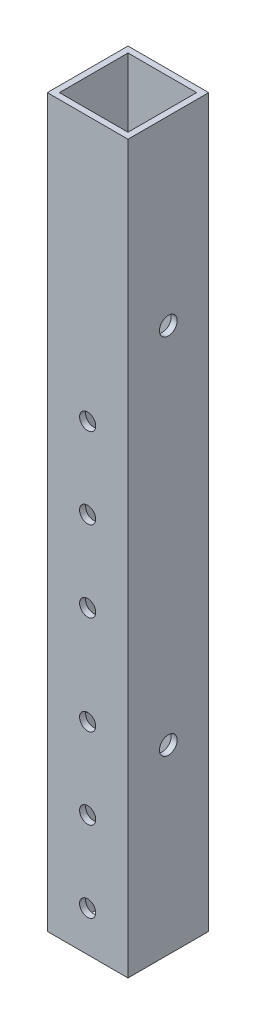
ISO-10303-21;
HEADER;
FILE_DESCRIPTION(('STEP AP214'),'2;1');
FILE_NAME('part.step','',(''),(''),'','','');
FILE_SCHEMA(('AUTOMOTIVE_DESIGN { 1 0 10303 214 1 1 1 1 }'));
ENDSEC;
DATA;
#1=APPLICATION_CONTEXT('core data for automotive mechanical design processes');
#2=APPLICATION_PROTOCOL_DEFINITION('international standard','automotive_design',2000,#1);
#3=PRODUCT_CONTEXT('',#1,'mechanical');
#4=PRODUCT('Part','Part','',(#3));
#5=PRODUCT_RELATED_PRODUCT_CATEGORY('part','',(#4));
#6=PRODUCT_DEFINITION_FORMATION('','',#4);
#7=PRODUCT_DEFINITION_CONTEXT('part definition',#1,'design');
#8=PRODUCT_DEFINITION('design','',#6,#7);
#9=PRODUCT_DEFINITION_SHAPE('','',#8);
#10=(LENGTH_UNIT() NAMED_UNIT(*) SI_UNIT(.MILLI.,.METRE.));
#11=(NAMED_UNIT(*) PLANE_ANGLE_UNIT() SI_UNIT($,.RADIAN.));
#12=(NAMED_UNIT(*) SI_UNIT($,.STERADIAN.) SOLID_ANGLE_UNIT());
#13=UNCERTAINTY_MEASURE_WITH_UNIT(LENGTH_MEASURE(1.E-05),#10,'distance_accuracy_value','');
#14=(GEOMETRIC_REPRESENTATION_CONTEXT(3) GLOBAL_UNCERTAINTY_ASSIGNED_CONTEXT((#13)) GLOBAL_UNIT_ASSIGNED_CONTEXT((#10,
#11,#12)) REPRESENTATION_CONTEXT('',''));
#15=CARTESIAN_POINT('',(0.,0.,0.));
#16=DIRECTION('',(0.,0.,1.));
#17=DIRECTION('',(1.,0.,0.));
#18=AXIS2_PLACEMENT_3D('',#15,#16,#17);
#19=CARTESIAN_POINT('',(0.,180.,0.));
#20=DIRECTION('',(0.,1.,0.));
#21=DIRECTION('',(0.,0.,1.));
#22=AXIS2_PLACEMENT_3D('',#19,#20,#21);
#23=PLANE('',#22);
#24=DIRECTION('',(0.,0.,-1.));
#25=VECTOR('',#24,1.);
#26=CARTESIAN_POINT('',(10.,180.,-10.));
#27=LINE('',#26,#25);
#28=CARTESIAN_POINT('',(10.,180.,10.));
#29=VERTEX_POINT('',#28);
#30=CARTESIAN_POINT('',(10.,180.,-10.));
#31=VERTEX_POINT('',#30);
#32=EDGE_CURVE('E144',#29,#31,#27,.T.);
#33=ORIENTED_EDGE('',*,*,#32,.T.);
#34=DIRECTION('',(-1.,0.,0.));
#35=VECTOR('',#34,1.);
#36=CARTESIAN_POINT('',(-10.,180.,-10.));
#37=LINE('',#36,#35);
#38=CARTESIAN_POINT('',(-10.,180.,-10.));
#39=VERTEX_POINT('',#38);
#40=EDGE_CURVE('E147',#31,#39,#37,.T.);
#41=ORIENTED_EDGE('',*,*,#40,.T.);
#42=DIRECTION('',(0.,0.,1.));
#43=VECTOR('',#42,1.);
#44=CARTESIAN_POINT('',(-10.,180.,-10.));
#45=LINE('',#44,#43);
#46=CARTESIAN_POINT('',(-10.,180.,10.));
#47=VERTEX_POINT('',#46);
#48=EDGE_CURVE('E150',#39,#47,#45,.T.);
#49=ORIENTED_EDGE('',*,*,#48,.T.);
#50=DIRECTION('',(1.,0.,0.));
#51=VECTOR('',#50,1.);
#52=CARTESIAN_POINT('',(-10.,180.,10.));
#53=LINE('',#52,#51);
#54=EDGE_CURVE('E152',#47,#29,#53,.T.);
#55=ORIENTED_EDGE('',*,*,#54,.T.);
#56=EDGE_LOOP('',(#33,#41,#49,#55));
#57=FACE_BOUND('',#56,.T.);
#58=DIRECTION('',(-1.,0.,0.));
#59=VECTOR('',#58,1.);
#60=CARTESIAN_POINT('',(-8.5,180.,-8.5));
#61=LINE('',#60,#59);
#62=CARTESIAN_POINT('',(8.5,180.,-8.5));
#63=VERTEX_POINT('',#62);
#64=CARTESIAN_POINT('',(-8.5,180.,-8.5));
#65=VERTEX_POINT('',#64);
#66=EDGE_CURVE('E114',#63,#65,#61,.T.);
#67=ORIENTED_EDGE('',*,*,#66,.F.);
#68=DIRECTION('',(0.,0.,-1.));
#69=VECTOR('',#68,1.);
#70=CARTESIAN_POINT('',(8.5,180.,-8.5));
#71=LINE('',#70,#69);
#72=CARTESIAN_POINT('',(8.5,180.,8.5));
#73=VERTEX_POINT('',#72);
#74=EDGE_CURVE('E106',#73,#63,#71,.T.);
#75=ORIENTED_EDGE('',*,*,#74,.F.);
#76=DIRECTION('',(1.,0.,0.));
#77=VECTOR('',#76,1.);
#78=CARTESIAN_POINT('',(-8.5,180.,8.5));
#79=LINE('',#78,#77);
#80=CARTESIAN_POINT('',(-8.5,180.,8.5));
#81=VERTEX_POINT('',#80);
#82=EDGE_CURVE('E128',#81,#73,#79,.T.);
#83=ORIENTED_EDGE('',*,*,#82,.F.);
#84=DIRECTION('',(0.,0.,1.));
#85=VECTOR('',#84,1.);
#86=CARTESIAN_POINT('',(-8.5,180.,-8.5));
#87=LINE('',#86,#85);
#88=EDGE_CURVE('E126',#65,#81,#87,.T.);
#89=ORIENTED_EDGE('',*,*,#88,.F.);
#90=EDGE_LOOP('',(#67,#75,#83,#89));
#91=FACE_BOUND('',#90,.T.);
#92=ADVANCED_FACE('F39',(#57,#91),#23,.T.);
#93=CARTESIAN_POINT('',(0.,0.,0.));
#94=DIRECTION('',(0.,1.,0.));
#95=DIRECTION('',(0.,0.,1.));
#96=AXIS2_PLACEMENT_3D('',#93,#94,#95);
#97=PLANE('',#96);
#98=DIRECTION('',(0.,0.,-1.));
#99=VECTOR('',#98,1.);
#100=CARTESIAN_POINT('',(10.,0.,-10.));
#101=LINE('',#100,#99);
#102=CARTESIAN_POINT('',(10.,0.,10.));
#103=VERTEX_POINT('',#102);
#104=CARTESIAN_POINT('',(10.,0.,-10.));
#105=VERTEX_POINT('',#104);
#106=EDGE_CURVE('E122',#103,#105,#101,.T.);
#107=ORIENTED_EDGE('',*,*,#106,.F.);
#108=DIRECTION('',(1.,0.,0.));
#109=VECTOR('',#108,1.);
#110=CARTESIAN_POINT('',(-10.,0.,10.));
#111=LINE('',#110,#109);
#112=CARTESIAN_POINT('',(-10.,0.,10.));
#113=VERTEX_POINT('',#112);
#114=EDGE_CURVE('E148',#113,#103,#111,.T.);
#115=ORIENTED_EDGE('',*,*,#114,.F.);
#116=DIRECTION('',(0.,0.,1.));
#117=VECTOR('',#116,1.);
#118=CARTESIAN_POINT('',(-10.,0.,-10.));
#119=LINE('',#118,#117);
#120=CARTESIAN_POINT('',(-10.,0.,-10.));
#121=VERTEX_POINT('',#120);
#122=EDGE_CURVE('E159',#121,#113,#119,.T.);
#123=ORIENTED_EDGE('',*,*,#122,.F.);
#124=DIRECTION('',(-1.,0.,0.));
#125=VECTOR('',#124,1.);
#126=CARTESIAN_POINT('',(-10.,0.,-10.));
#127=LINE('',#126,#125);
#128=EDGE_CURVE('E157',#105,#121,#127,.T.);
#129=ORIENTED_EDGE('',*,*,#128,.F.);
#130=EDGE_LOOP('',(#107,#115,#123,#129));
#131=FACE_BOUND('',#130,.T.);
#132=DIRECTION('',(0.,0.,-1.));
#133=VECTOR('',#132,1.);
#134=CARTESIAN_POINT('',(8.5,0.,-8.5));
#135=LINE('',#134,#133);
#136=CARTESIAN_POINT('',(8.5,0.,8.5));
#137=VERTEX_POINT('',#136);
#138=CARTESIAN_POINT('',(8.5,0.,-8.5));
#139=VERTEX_POINT('',#138);
#140=EDGE_CURVE('E64',#137,#139,#135,.T.);
#141=ORIENTED_EDGE('',*,*,#140,.T.);
#142=DIRECTION('',(-1.,0.,0.));
#143=VECTOR('',#142,1.);
#144=CARTESIAN_POINT('',(-8.5,0.,-8.5));
#145=LINE('',#144,#143);
#146=CARTESIAN_POINT('',(-8.5,0.,-8.5));
#147=VERTEX_POINT('',#146);
#148=EDGE_CURVE('E121',#139,#147,#145,.T.);
#149=ORIENTED_EDGE('',*,*,#148,.T.);
#150=DIRECTION('',(0.,0.,1.));
#151=VECTOR('',#150,1.);
#152=CARTESIAN_POINT('',(-8.5,0.,-8.5));
#153=LINE('',#152,#151);
#154=CARTESIAN_POINT('',(-8.5,0.,8.5));
#155=VERTEX_POINT('',#154);
#156=EDGE_CURVE('E136',#147,#155,#153,.T.);
#157=ORIENTED_EDGE('',*,*,#156,.T.);
#158=DIRECTION('',(1.,0.,0.));
#159=VECTOR('',#158,1.);
#160=CARTESIAN_POINT('',(-8.5,0.,8.5));
#161=LINE('',#160,#159);
#162=EDGE_CURVE('E115',#155,#137,#161,.T.);
#163=ORIENTED_EDGE('',*,*,#162,.T.);
#164=EDGE_LOOP('',(#141,#149,#157,#163));
#165=FACE_BOUND('',#164,.T.);
#166=ADVANCED_FACE('F255',(#131,#165),#97,.F.);
#167=CARTESIAN_POINT('',(10.,180.,-10.));
#168=DIRECTION('',(-1.,0.,0.));
#169=DIRECTION('',(0.,0.,1.));
#170=AXIS2_PLACEMENT_3D('',#167,#168,#169);
#171=PLANE('',#170);
#172=CARTESIAN_POINT('',(10.,135.,0.));
#173=DIRECTION('',(1.,0.,0.));
#174=DIRECTION('',(0.,0.,-1.));
#175=AXIS2_PLACEMENT_3D('',#172,#173,#174);
#176=CIRCLE('',#175,2.2);
#177=CARTESIAN_POINT('',(10.,135.,-2.2));
#178=VERTEX_POINT('',#177);
#179=EDGE_CURVE('E173',#178,#178,#176,.T.);
#180=ORIENTED_EDGE('',*,*,#179,.F.);
#181=EDGE_LOOP('',(#180));
#182=FACE_BOUND('',#181,.T.);
#183=CARTESIAN_POINT('',(10.,45.,0.));
#184=DIRECTION('',(1.,0.,0.));
#185=DIRECTION('',(0.,0.,1.));
#186=AXIS2_PLACEMENT_3D('',#183,#184,#185);
#187=CIRCLE('',#186,2.19999999999999);
#188=CARTESIAN_POINT('',(10.,45.,2.19999999999999));
#189=VERTEX_POINT('',#188);
#190=EDGE_CURVE('E189',#189,#189,#187,.T.);
#191=ORIENTED_EDGE('',*,*,#190,.F.);
#192=EDGE_LOOP('',(#191));
#193=FACE_BOUND('',#192,.T.);
#194=ORIENTED_EDGE('',*,*,#106,.T.);
#195=DIRECTION('',(0.,-1.,0.));
#196=VECTOR('',#195,1.);
#197=CARTESIAN_POINT('',(10.,180.,-10.));
#198=LINE('',#197,#196);
#199=EDGE_CURVE('E11',#31,#105,#198,.T.);
#200=ORIENTED_EDGE('',*,*,#199,.F.);
#201=ORIENTED_EDGE('',*,*,#32,.F.);
#202=DIRECTION('',(0.,-1.,0.));
#203=VECTOR('',#202,1.);
#204=CARTESIAN_POINT('',(10.,180.,10.));
#205=LINE('',#204,#203);
#206=EDGE_CURVE('E154',#29,#103,#205,.T.);
#207=ORIENTED_EDGE('',*,*,#206,.T.);
#208=EDGE_LOOP('',(#194,#200,#201,#207));
#209=FACE_BOUND('',#208,.T.);
#210=ADVANCED_FACE('F41',(#182,#193,#209),#171,.F.);
#211=CARTESIAN_POINT('',(-10.,180.,-10.));
#212=DIRECTION('',(0.,0.,1.));
#213=DIRECTION('',(1.,0.,0.));
#214=AXIS2_PLACEMENT_3D('',#211,#212,#213);
#215=PLANE('',#214);
#216=CARTESIAN_POINT('',(0.,74.45,-10.));
#217=DIRECTION('',(0.,0.,1.));
#218=DIRECTION('',(1.,0.,0.));
#219=AXIS2_PLACEMENT_3D('',#216,#217,#218);
#220=CIRCLE('',#219,2.);
#221=CARTESIAN_POINT('',(2.,74.45,-10.));
#222=VERTEX_POINT('',#221);
#223=EDGE_CURVE('E193',#222,#222,#220,.T.);
#224=ORIENTED_EDGE('',*,*,#223,.T.);
#225=EDGE_LOOP('',(#224));
#226=FACE_BOUND('',#225,.T.);
#227=CARTESIAN_POINT('',(0.,94.45,-10.));
#228=DIRECTION('',(0.,0.,1.));
#229=DIRECTION('',(1.,0.,0.));
#230=AXIS2_PLACEMENT_3D('',#227,#228,#229);
#231=CIRCLE('',#230,2.);
#232=CARTESIAN_POINT('',(2.,94.45,-10.));
#233=VERTEX_POINT('',#232);
#234=EDGE_CURVE('E284',#233,#233,#231,.T.);
#235=ORIENTED_EDGE('',*,*,#234,.T.);
#236=EDGE_LOOP('',(#235));
#237=FACE_BOUND('',#236,.T.);
#238=CARTESIAN_POINT('',(0.,114.45,-10.));
#239=DIRECTION('',(0.,0.,1.));
#240=DIRECTION('',(1.,0.,0.));
#241=AXIS2_PLACEMENT_3D('',#238,#239,#240);
#242=CIRCLE('',#241,2.);
#243=CARTESIAN_POINT('',(2.,114.45,-10.));
#244=VERTEX_POINT('',#243);
#245=EDGE_CURVE('E206',#244,#244,#242,.T.);
#246=ORIENTED_EDGE('',*,*,#245,.T.);
#247=EDGE_LOOP('',(#246));
#248=FACE_BOUND('',#247,.T.);
#249=ORIENTED_EDGE('',*,*,#128,.T.);
#250=DIRECTION('',(0.,-1.,0.));
#251=VECTOR('',#250,1.);
#252=CARTESIAN_POINT('',(-10.,180.,-10.));
#253=LINE('',#252,#251);
#254=EDGE_CURVE('E48',#39,#121,#253,.T.);
#255=ORIENTED_EDGE('',*,*,#254,.F.);
#256=ORIENTED_EDGE('',*,*,#40,.F.);
#257=ORIENTED_EDGE('',*,*,#199,.T.);
#258=EDGE_LOOP('',(#249,#255,#256,#257));
#259=FACE_BOUND('',#258,.T.);
#260=ADVANCED_FACE('F271',(#226,#237,#248,#259),#215,.F.);
#261=CARTESIAN_POINT('',(-10.,180.,-10.));
#262=DIRECTION('',(1.,0.,0.));
#263=DIRECTION('',(0.,0.,-1.));
#264=AXIS2_PLACEMENT_3D('',#261,#262,#263);
#265=PLANE('',#264);
#266=CARTESIAN_POINT('',(-9.99999999999999,135.,0.));
#267=DIRECTION('',(1.,0.,0.));
#268=DIRECTION('',(0.,0.,-1.));
#269=AXIS2_PLACEMENT_3D('',#266,#267,#268);
#270=CIRCLE('',#269,2.2);
#271=CARTESIAN_POINT('',(-10.,135.,-2.2));
#272=VERTEX_POINT('',#271);
#273=EDGE_CURVE('E134',#272,#272,#270,.T.);
#274=ORIENTED_EDGE('',*,*,#273,.T.);
#275=EDGE_LOOP('',(#274));
#276=FACE_BOUND('',#275,.T.);
#277=CARTESIAN_POINT('',(-9.99999999999999,45.,0.));
#278=DIRECTION('',(1.,0.,0.));
#279=DIRECTION('',(0.,0.,-1.));
#280=AXIS2_PLACEMENT_3D('',#277,#278,#279);
#281=CIRCLE('',#280,2.19999999999999);
#282=CARTESIAN_POINT('',(-10.,45.,-2.19999999999999));
#283=VERTEX_POINT('',#282);
#284=EDGE_CURVE('E178',#283,#283,#281,.T.);
#285=ORIENTED_EDGE('',*,*,#284,.T.);
#286=EDGE_LOOP('',(#285));
#287=FACE_BOUND('',#286,.T.);
#288=ORIENTED_EDGE('',*,*,#122,.T.);
#289=DIRECTION('',(0.,-1.,0.));
#290=VECTOR('',#289,1.);
#291=CARTESIAN_POINT('',(-10.,180.,10.));
#292=LINE('',#291,#290);
#293=EDGE_CURVE('E164',#47,#113,#292,.T.);
#294=ORIENTED_EDGE('',*,*,#293,.F.);
#295=ORIENTED_EDGE('',*,*,#48,.F.);
#296=ORIENTED_EDGE('',*,*,#254,.T.);
#297=EDGE_LOOP('',(#288,#294,#295,#296));
#298=FACE_BOUND('',#297,.T.);
#299=ADVANCED_FACE('F232',(#276,#287,#298),#265,.F.);
#300=CARTESIAN_POINT('',(-10.,180.,10.));
#301=DIRECTION('',(0.,0.,-1.));
#302=DIRECTION('',(-1.,0.,0.));
#303=AXIS2_PLACEMENT_3D('',#300,#301,#302);
#304=PLANE('',#303);
#305=CARTESIAN_POINT('',(0.,74.45,10.));
#306=DIRECTION('',(0.,0.,1.));
#307=DIRECTION('',(1.,0.,0.));
#308=AXIS2_PLACEMENT_3D('',#305,#306,#307);
#309=CIRCLE('',#308,2.);
#310=CARTESIAN_POINT('',(2.,74.45,10.));
#311=VERTEX_POINT('',#310);
#312=EDGE_CURVE('E336',#311,#311,#309,.T.);
#313=ORIENTED_EDGE('',*,*,#312,.F.);
#314=EDGE_LOOP('',(#313));
#315=FACE_BOUND('',#314,.T.);
#316=CARTESIAN_POINT('',(0.,94.45,10.));
#317=DIRECTION('',(0.,0.,1.));
#318=DIRECTION('',(1.,0.,0.));
#319=AXIS2_PLACEMENT_3D('',#316,#317,#318);
#320=CIRCLE('',#319,2.);
#321=CARTESIAN_POINT('',(2.,94.45,10.));
#322=VERTEX_POINT('',#321);
#323=EDGE_CURVE('E332',#322,#322,#320,.T.);
#324=ORIENTED_EDGE('',*,*,#323,.F.);
#325=EDGE_LOOP('',(#324));
#326=FACE_BOUND('',#325,.T.);
#327=CARTESIAN_POINT('',(0.,114.45,10.));
#328=DIRECTION('',(0.,0.,1.));
#329=DIRECTION('',(1.,0.,0.));
#330=AXIS2_PLACEMENT_3D('',#327,#328,#329);
#331=CIRCLE('',#330,2.);
#332=CARTESIAN_POINT('',(2.,114.45,10.));
#333=VERTEX_POINT('',#332);
#334=EDGE_CURVE('E333',#333,#333,#331,.T.);
#335=ORIENTED_EDGE('',*,*,#334,.F.);
#336=EDGE_LOOP('',(#335));
#337=FACE_BOUND('',#336,.T.);
#338=CARTESIAN_POINT('',(0.,10.,10.));
#339=DIRECTION('',(0.,0.,1.));
#340=DIRECTION('',(1.,0.,0.));
#341=AXIS2_PLACEMENT_3D('',#338,#339,#340);
#342=CIRCLE('',#341,2.);
#343=CARTESIAN_POINT('',(2.,10.,10.));
#344=VERTEX_POINT('',#343);
#345=EDGE_CURVE('E183',#344,#344,#342,.T.);
#346=ORIENTED_EDGE('',*,*,#345,.F.);
#347=EDGE_LOOP('',(#346));
#348=FACE_BOUND('',#347,.T.);
#349=CARTESIAN_POINT('',(0.,30.,10.));
#350=DIRECTION('',(0.,0.,1.));
#351=DIRECTION('',(1.,0.,0.));
#352=AXIS2_PLACEMENT_3D('',#349,#350,#351);
#353=CIRCLE('',#352,2.);
#354=CARTESIAN_POINT('',(2.,30.,10.));
#355=VERTEX_POINT('',#354);
#356=EDGE_CURVE('E215',#355,#355,#353,.T.);
#357=ORIENTED_EDGE('',*,*,#356,.F.);
#358=EDGE_LOOP('',(#357));
#359=FACE_BOUND('',#358,.T.);
#360=CARTESIAN_POINT('',(0.,50.,10.));
#361=DIRECTION('',(0.,0.,1.));
#362=DIRECTION('',(1.,0.,0.));
#363=AXIS2_PLACEMENT_3D('',#360,#361,#362);
#364=CIRCLE('',#363,2.);
#365=CARTESIAN_POINT('',(2.,50.,10.));
#366=VERTEX_POINT('',#365);
#367=EDGE_CURVE('E212',#366,#366,#364,.T.);
#368=ORIENTED_EDGE('',*,*,#367,.F.);
#369=EDGE_LOOP('',(#368));
#370=FACE_BOUND('',#369,.T.);
#371=ORIENTED_EDGE('',*,*,#114,.T.);
#372=ORIENTED_EDGE('',*,*,#206,.F.);
#373=ORIENTED_EDGE('',*,*,#54,.F.);
#374=ORIENTED_EDGE('',*,*,#293,.T.);
#375=EDGE_LOOP('',(#371,#372,#373,#374));
#376=FACE_BOUND('',#375,.T.);
#377=ADVANCED_FACE('F266',(#315,#326,#337,#348,#359,#370,#376),#304,.F.);
#378=CARTESIAN_POINT('',(8.5,180.,-8.5));
#379=DIRECTION('',(-1.,0.,0.));
#380=DIRECTION('',(0.,0.,1.));
#381=AXIS2_PLACEMENT_3D('',#378,#379,#380);
#382=PLANE('',#381);
#383=CARTESIAN_POINT('',(8.50000000000001,135.,0.));
#384=DIRECTION('',(-1.,0.,0.));
#385=DIRECTION('',(0.,0.,1.));
#386=AXIS2_PLACEMENT_3D('',#383,#384,#385);
#387=CIRCLE('',#386,2.2);
#388=CARTESIAN_POINT('',(8.50000000000001,135.,2.2));
#389=VERTEX_POINT('',#388);
#390=EDGE_CURVE('E177',#389,#389,#387,.T.);
#391=ORIENTED_EDGE('',*,*,#390,.F.);
#392=EDGE_LOOP('',(#391));
#393=FACE_BOUND('',#392,.T.);
#394=CARTESIAN_POINT('',(8.50000000000001,45.,0.));
#395=DIRECTION('',(-1.,0.,0.));
#396=DIRECTION('',(0.,0.,1.));
#397=AXIS2_PLACEMENT_3D('',#394,#395,#396);
#398=CIRCLE('',#397,2.19999999999999);
#399=CARTESIAN_POINT('',(8.50000000000001,45.,2.19999999999999));
#400=VERTEX_POINT('',#399);
#401=EDGE_CURVE('E172',#400,#400,#398,.T.);
#402=ORIENTED_EDGE('',*,*,#401,.F.);
#403=EDGE_LOOP('',(#402));
#404=FACE_BOUND('',#403,.T.);
#405=ORIENTED_EDGE('',*,*,#140,.F.);
#406=DIRECTION('',(0.,-1.,0.));
#407=VECTOR('',#406,1.);
#408=CARTESIAN_POINT('',(8.5,180.,8.5));
#409=LINE('',#408,#407);
#410=EDGE_CURVE('E110',#73,#137,#409,.T.);
#411=ORIENTED_EDGE('',*,*,#410,.F.);
#412=ORIENTED_EDGE('',*,*,#74,.T.);
#413=DIRECTION('',(0.,-1.,0.));
#414=VECTOR('',#413,1.);
#415=CARTESIAN_POINT('',(8.5,180.,-8.5));
#416=LINE('',#415,#414);
#417=EDGE_CURVE('E109',#63,#139,#416,.T.);
#418=ORIENTED_EDGE('',*,*,#417,.T.);
#419=EDGE_LOOP('',(#405,#411,#412,#418));
#420=FACE_BOUND('',#419,.T.);
#421=ADVANCED_FACE('F108',(#393,#404,#420),#382,.T.);
#422=CARTESIAN_POINT('',(-8.5,180.,-8.5));
#423=DIRECTION('',(0.,0.,1.));
#424=DIRECTION('',(1.,0.,0.));
#425=AXIS2_PLACEMENT_3D('',#422,#423,#424);
#426=PLANE('',#425);
#427=CARTESIAN_POINT('',(0.,74.45,-8.5));
#428=DIRECTION('',(0.,0.,1.));
#429=DIRECTION('',(1.,0.,0.));
#430=AXIS2_PLACEMENT_3D('',#427,#428,#429);
#431=CIRCLE('',#430,2.);
#432=CARTESIAN_POINT('',(2.,74.45,-8.5));
#433=VERTEX_POINT('',#432);
#434=EDGE_CURVE('E209',#433,#433,#431,.T.);
#435=ORIENTED_EDGE('',*,*,#434,.F.);
#436=EDGE_LOOP('',(#435));
#437=FACE_BOUND('',#436,.T.);
#438=CARTESIAN_POINT('',(0.,94.45,-8.5));
#439=DIRECTION('',(0.,0.,1.));
#440=DIRECTION('',(1.,0.,0.));
#441=AXIS2_PLACEMENT_3D('',#438,#439,#440);
#442=CIRCLE('',#441,2.);
#443=CARTESIAN_POINT('',(2.,94.45,-8.5));
#444=VERTEX_POINT('',#443);
#445=EDGE_CURVE('E196',#444,#444,#442,.T.);
#446=ORIENTED_EDGE('',*,*,#445,.F.);
#447=EDGE_LOOP('',(#446));
#448=FACE_BOUND('',#447,.T.);
#449=CARTESIAN_POINT('',(0.,114.45,-8.5));
#450=DIRECTION('',(0.,0.,1.));
#451=DIRECTION('',(1.,0.,0.));
#452=AXIS2_PLACEMENT_3D('',#449,#450,#451);
#453=CIRCLE('',#452,2.);
#454=CARTESIAN_POINT('',(2.,114.45,-8.5));
#455=VERTEX_POINT('',#454);
#456=EDGE_CURVE('E192',#455,#455,#453,.T.);
#457=ORIENTED_EDGE('',*,*,#456,.F.);
#458=EDGE_LOOP('',(#457));
#459=FACE_BOUND('',#458,.T.);
#460=ORIENTED_EDGE('',*,*,#148,.F.);
#461=ORIENTED_EDGE('',*,*,#417,.F.);
#462=ORIENTED_EDGE('',*,*,#66,.T.);
#463=DIRECTION('',(0.,-1.,0.));
#464=VECTOR('',#463,1.);
#465=CARTESIAN_POINT('',(-8.5,180.,-8.5));
#466=LINE('',#465,#464);
#467=EDGE_CURVE('E123',#65,#147,#466,.T.);
#468=ORIENTED_EDGE('',*,*,#467,.T.);
#469=EDGE_LOOP('',(#460,#461,#462,#468));
#470=FACE_BOUND('',#469,.T.);
#471=ADVANCED_FACE('F118',(#437,#448,#459,#470),#426,.T.);
#472=CARTESIAN_POINT('',(-8.5,180.,-8.5));
#473=DIRECTION('',(1.,0.,0.));
#474=DIRECTION('',(0.,0.,-1.));
#475=AXIS2_PLACEMENT_3D('',#472,#473,#474);
#476=PLANE('',#475);
#477=CARTESIAN_POINT('',(-8.50000000000001,135.,0.));
#478=DIRECTION('',(1.,0.,0.));
#479=DIRECTION('',(0.,0.,-1.));
#480=AXIS2_PLACEMENT_3D('',#477,#478,#479);
#481=CIRCLE('',#480,2.2);
#482=CARTESIAN_POINT('',(-8.50000000000001,135.,-2.2));
#483=VERTEX_POINT('',#482);
#484=EDGE_CURVE('E174',#483,#483,#481,.T.);
#485=ORIENTED_EDGE('',*,*,#484,.F.);
#486=EDGE_LOOP('',(#485));
#487=FACE_BOUND('',#486,.T.);
#488=CARTESIAN_POINT('',(-8.50000000000001,45.,0.));
#489=DIRECTION('',(1.,0.,0.));
#490=DIRECTION('',(0.,0.,-1.));
#491=AXIS2_PLACEMENT_3D('',#488,#489,#490);
#492=CIRCLE('',#491,2.19999999999999);
#493=CARTESIAN_POINT('',(-8.50000000000001,45.,-2.19999999999999));
#494=VERTEX_POINT('',#493);
#495=EDGE_CURVE('E169',#494,#494,#492,.T.);
#496=ORIENTED_EDGE('',*,*,#495,.F.);
#497=EDGE_LOOP('',(#496));
#498=FACE_BOUND('',#497,.T.);
#499=ORIENTED_EDGE('',*,*,#156,.F.);
#500=ORIENTED_EDGE('',*,*,#467,.F.);
#501=ORIENTED_EDGE('',*,*,#88,.T.);
#502=DIRECTION('',(0.,-1.,0.));
#503=VECTOR('',#502,1.);
#504=CARTESIAN_POINT('',(-8.5,180.,8.5));
#505=LINE('',#504,#503);
#506=EDGE_CURVE('E56',#81,#155,#505,.T.);
#507=ORIENTED_EDGE('',*,*,#506,.T.);
#508=EDGE_LOOP('',(#499,#500,#501,#507));
#509=FACE_BOUND('',#508,.T.);
#510=ADVANCED_FACE('F304',(#487,#498,#509),#476,.T.);
#511=CARTESIAN_POINT('',(-8.5,180.,8.5));
#512=DIRECTION('',(0.,0.,-1.));
#513=DIRECTION('',(-1.,0.,0.));
#514=AXIS2_PLACEMENT_3D('',#511,#512,#513);
#515=PLANE('',#514);
#516=CARTESIAN_POINT('',(0.,74.45,8.5));
#517=DIRECTION('',(0.,0.,-1.));
#518=DIRECTION('',(-1.,0.,0.));
#519=AXIS2_PLACEMENT_3D('',#516,#517,#518);
#520=CIRCLE('',#519,2.);
#521=CARTESIAN_POINT('',(-2.,74.45,8.5));
#522=VERTEX_POINT('',#521);
#523=EDGE_CURVE('E43',#522,#522,#520,.T.);
#524=ORIENTED_EDGE('',*,*,#523,.F.);
#525=EDGE_LOOP('',(#524));
#526=FACE_BOUND('',#525,.T.);
#527=CARTESIAN_POINT('',(0.,94.45,8.5));
#528=DIRECTION('',(0.,0.,-1.));
#529=DIRECTION('',(-1.,0.,0.));
#530=AXIS2_PLACEMENT_3D('',#527,#528,#529);
#531=CIRCLE('',#530,2.);
#532=CARTESIAN_POINT('',(-2.,94.45,8.5));
#533=VERTEX_POINT('',#532);
#534=EDGE_CURVE('E194',#533,#533,#531,.T.);
#535=ORIENTED_EDGE('',*,*,#534,.F.);
#536=EDGE_LOOP('',(#535));
#537=FACE_BOUND('',#536,.T.);
#538=CARTESIAN_POINT('',(0.,114.45,8.5));
#539=DIRECTION('',(0.,0.,-1.));
#540=DIRECTION('',(-1.,0.,0.));
#541=AXIS2_PLACEMENT_3D('',#538,#539,#540);
#542=CIRCLE('',#541,2.);
#543=CARTESIAN_POINT('',(-2.,114.45,8.5));
#544=VERTEX_POINT('',#543);
#545=EDGE_CURVE('E190',#544,#544,#542,.T.);
#546=ORIENTED_EDGE('',*,*,#545,.F.);
#547=EDGE_LOOP('',(#546));
#548=FACE_BOUND('',#547,.T.);
#549=CARTESIAN_POINT('',(0.,10.,8.5));
#550=DIRECTION('',(0.,0.,-1.));
#551=DIRECTION('',(-1.,0.,0.));
#552=AXIS2_PLACEMENT_3D('',#549,#550,#551);
#553=CIRCLE('',#552,2.);
#554=CARTESIAN_POINT('',(-2.,10.,8.5));
#555=VERTEX_POINT('',#554);
#556=EDGE_CURVE('E186',#555,#555,#553,.T.);
#557=ORIENTED_EDGE('',*,*,#556,.F.);
#558=EDGE_LOOP('',(#557));
#559=FACE_BOUND('',#558,.T.);
#560=CARTESIAN_POINT('',(0.,30.,8.5));
#561=DIRECTION('',(0.,0.,-1.));
#562=DIRECTION('',(-1.,0.,0.));
#563=AXIS2_PLACEMENT_3D('',#560,#561,#562);
#564=CIRCLE('',#563,2.);
#565=CARTESIAN_POINT('',(-2.,30.,8.5));
#566=VERTEX_POINT('',#565);
#567=EDGE_CURVE('E182',#566,#566,#564,.T.);
#568=ORIENTED_EDGE('',*,*,#567,.F.);
#569=EDGE_LOOP('',(#568));
#570=FACE_BOUND('',#569,.T.);
#571=CARTESIAN_POINT('',(0.,50.,8.5));
#572=DIRECTION('',(0.,0.,-1.));
#573=DIRECTION('',(-1.,0.,0.));
#574=AXIS2_PLACEMENT_3D('',#571,#572,#573);
#575=CIRCLE('',#574,2.);
#576=CARTESIAN_POINT('',(-2.,50.,8.5));
#577=VERTEX_POINT('',#576);
#578=EDGE_CURVE('E179',#577,#577,#575,.T.);
#579=ORIENTED_EDGE('',*,*,#578,.F.);
#580=EDGE_LOOP('',(#579));
#581=FACE_BOUND('',#580,.T.);
#582=ORIENTED_EDGE('',*,*,#162,.F.);
#583=ORIENTED_EDGE('',*,*,#506,.F.);
#584=ORIENTED_EDGE('',*,*,#82,.T.);
#585=ORIENTED_EDGE('',*,*,#410,.T.);
#586=EDGE_LOOP('',(#582,#583,#584,#585));
#587=FACE_BOUND('',#586,.T.);
#588=ADVANCED_FACE('F248',(#526,#537,#548,#559,#570,#581,#587),#515,.T.);
#589=CARTESIAN_POINT('',(-110.,45.,0.));
#590=DIRECTION('',(1.,0.,0.));
#591=DIRECTION('',(0.,0.,-1.));
#592=AXIS2_PLACEMENT_3D('',#589,#590,#591);
#593=CYLINDRICAL_SURFACE('',#592,2.19999999999999);
#594=CARTESIAN_POINT('',(-8.50000000000001,45.,-2.19999999999999));
#595=CARTESIAN_POINT('',(-8.51562500000001,45.,-2.19999999999999));
#596=CARTESIAN_POINT('',(-8.53125000000001,45.,-2.19999999999999));
#597=CARTESIAN_POINT('',(-8.56250000000001,45.,-2.19999999999999));
#598=CARTESIAN_POINT('',(-8.57812500000001,45.,-2.19999999999999));
#599=CARTESIAN_POINT('',(-8.60937500000001,45.,-2.19999999999999));
#600=CARTESIAN_POINT('',(-8.62500000000001,45.,-2.19999999999999));
#601=CARTESIAN_POINT('',(-8.65625000000001,45.,-2.19999999999999));
#602=CARTESIAN_POINT('',(-8.67187500000001,45.,-2.19999999999999));
#603=CARTESIAN_POINT('',(-8.70312500000001,45.,-2.19999999999999));
#604=CARTESIAN_POINT('',(-8.71875000000001,45.,-2.19999999999999));
#605=CARTESIAN_POINT('',(-8.75,45.,-2.19999999999999));
#606=CARTESIAN_POINT('',(-8.765625,45.,-2.19999999999999));
#607=CARTESIAN_POINT('',(-8.796875,45.,-2.19999999999999));
#608=CARTESIAN_POINT('',(-8.81250000000001,45.,-2.19999999999999));
#609=CARTESIAN_POINT('',(-8.84375000000001,45.,-2.19999999999999));
#610=CARTESIAN_POINT('',(-8.85937500000001,45.,-2.19999999999999));
#611=CARTESIAN_POINT('',(-8.89062500000001,45.,-2.19999999999999));
#612=CARTESIAN_POINT('',(-8.90625000000001,45.,-2.19999999999999));
#613=CARTESIAN_POINT('',(-8.93750000000001,45.,-2.19999999999999));
#614=CARTESIAN_POINT('',(-8.95312500000001,45.,-2.19999999999999));
#615=CARTESIAN_POINT('',(-8.98437500000001,45.,-2.19999999999999));
#616=CARTESIAN_POINT('',(-9.00000000000001,45.,-2.19999999999999));
#617=CARTESIAN_POINT('',(-9.03125000000001,45.,-2.19999999999999));
#618=CARTESIAN_POINT('',(-9.04687500000001,45.,-2.19999999999999));
#619=CARTESIAN_POINT('',(-9.078125,45.,-2.19999999999999));
#620=CARTESIAN_POINT('',(-9.09375,45.,-2.19999999999999));
#621=CARTESIAN_POINT('',(-9.125,45.,-2.19999999999999));
#622=CARTESIAN_POINT('',(-9.14062500000001,45.,-2.19999999999999));
#623=CARTESIAN_POINT('',(-9.17187500000001,45.,-2.19999999999999));
#624=CARTESIAN_POINT('',(-9.18750000000001,45.,-2.19999999999999));
#625=CARTESIAN_POINT('',(-9.21875000000001,45.,-2.19999999999999));
#626=CARTESIAN_POINT('',(-9.23437500000001,45.,-2.19999999999999));
#627=CARTESIAN_POINT('',(-9.26562500000001,45.,-2.19999999999999));
#628=CARTESIAN_POINT('',(-9.28125000000001,45.,-2.19999999999999));
#629=CARTESIAN_POINT('',(-9.31250000000001,45.,-2.19999999999999));
#630=CARTESIAN_POINT('',(-9.32812500000001,45.,-2.19999999999999));
#631=CARTESIAN_POINT('',(-9.35937500000001,45.,-2.19999999999999));
#632=CARTESIAN_POINT('',(-9.37500000000001,45.,-2.19999999999999));
#633=CARTESIAN_POINT('',(-9.40625000000001,45.,-2.19999999999999));
#634=CARTESIAN_POINT('',(-9.42187500000002,45.,-2.19999999999999));
#635=CARTESIAN_POINT('',(-9.45312500000001,45.,-2.19999999999999));
#636=CARTESIAN_POINT('',(-9.46875000000001,45.,-2.19999999999999));
#637=CARTESIAN_POINT('',(-9.5,45.,-2.19999999999999));
#638=CARTESIAN_POINT('',(-9.51562500000001,45.,-2.19999999999999));
#639=CARTESIAN_POINT('',(-9.54687500000001,45.,-2.19999999999999));
#640=CARTESIAN_POINT('',(-9.56250000000001,45.,-2.19999999999999));
#641=CARTESIAN_POINT('',(-9.59375000000001,45.,-2.19999999999999));
#642=CARTESIAN_POINT('',(-9.60937500000001,45.,-2.19999999999999));
#643=CARTESIAN_POINT('',(-9.64062500000001,45.,-2.19999999999999));
#644=CARTESIAN_POINT('',(-9.65625000000001,45.,-2.19999999999999));
#645=CARTESIAN_POINT('',(-9.68750000000001,45.,-2.19999999999999));
#646=CARTESIAN_POINT('',(-9.70312500000001,45.,-2.19999999999999));
#647=CARTESIAN_POINT('',(-9.73437500000001,45.,-2.19999999999999));
#648=CARTESIAN_POINT('',(-9.75000000000001,45.,-2.19999999999999));
#649=CARTESIAN_POINT('',(-9.78125000000001,45.,-2.19999999999999));
#650=CARTESIAN_POINT('',(-9.79687500000001,45.,-2.19999999999999));
#651=CARTESIAN_POINT('',(-9.828125,45.,-2.19999999999999));
#652=CARTESIAN_POINT('',(-9.84375,45.,-2.19999999999999));
#653=CARTESIAN_POINT('',(-9.875,45.,-2.19999999999999));
#654=CARTESIAN_POINT('',(-9.89062500000001,45.,-2.19999999999999));
#655=CARTESIAN_POINT('',(-9.92187500000001,45.,-2.19999999999999));
#656=CARTESIAN_POINT('',(-9.93750000000001,45.,-2.19999999999999));
#657=CARTESIAN_POINT('',(-9.96875000000001,45.,-2.19999999999999));
#658=CARTESIAN_POINT('',(-9.98437500000001,45.,-2.19999999999999));
#659=CARTESIAN_POINT('',(-10.,45.,-2.19999999999999));
#660=B_SPLINE_CURVE_WITH_KNOTS('',3,(#594,#595,#596,#597,#598,#599,#600,#601,#602,#603,#604,
#605,#606,#607,#608,#609,#610,#611,#612,#613,#614,#615,#616,#617,#618,#619,#620,#621,#622,#623,
#624,#625,#626,#627,#628,#629,#630,#631,#632,#633,#634,#635,#636,#637,#638,#639,#640,#641,#642,
#643,#644,#645,#646,#647,#648,#649,#650,#651,#652,#653,#654,#655,#656,#657,#658,#659),
.UNSPECIFIED.,.F.,.F.,(4,2,2,2,2,2,2,2,2,2,2,2,2,2,2,2,2,2,2,2,2,2,2,2,2,2,2,2,2,2,2,2,4),(0.,
0.0468750000000018,0.0937500000000036,0.140625000000005,0.187500000000007,0.234374999999995,
0.281249999999997,0.328124999999999,0.375,0.421875000000002,0.468750000000004,0.515625000000006,
0.562499999999994,0.609374999999995,0.656249999999997,0.703124999999999,0.750000000000001,
0.796875000000002,0.843750000000004,0.890625000000006,0.937500000000008,0.984374999999996,
1.03125,1.078125,1.125,1.171875,1.21875,1.26562500000001,1.31249999999999,1.359375,1.40625,
1.453125,1.5),.UNSPECIFIED.);
#661=EDGE_CURVE('BSEAM238',#494,#283,#660,.T.);
#662=ORIENTED_EDGE('',*,*,#495,.T.);
#663=ORIENTED_EDGE('',*,*,#284,.F.);
#664=ORIENTED_EDGE('',*,*,#661,.T.);
#665=ORIENTED_EDGE('',*,*,#661,.F.);
#666=EDGE_LOOP('',(#662,#664,#663,#665));
#667=FACE_BOUND('',#666,.T.);
#668=ADVANCED_FACE('F238',(#667),#593,.F.);
#669=CARTESIAN_POINT('',(-110.,135.,0.));
#670=DIRECTION('',(1.,0.,0.));
#671=DIRECTION('',(0.,0.,-1.));
#672=AXIS2_PLACEMENT_3D('',#669,#670,#671);
#673=CYLINDRICAL_SURFACE('',#672,2.2);
#674=CARTESIAN_POINT('',(-8.50000000000001,135.,-2.2));
#675=CARTESIAN_POINT('',(-8.51562500000001,135.,-2.2));
#676=CARTESIAN_POINT('',(-8.53125000000001,135.,-2.2));
#677=CARTESIAN_POINT('',(-8.56250000000001,135.,-2.2));
#678=CARTESIAN_POINT('',(-8.57812500000001,135.,-2.2));
#679=CARTESIAN_POINT('',(-8.60937500000001,135.,-2.2));
#680=CARTESIAN_POINT('',(-8.62500000000001,135.,-2.2));
#681=CARTESIAN_POINT('',(-8.65625000000001,135.,-2.2));
#682=CARTESIAN_POINT('',(-8.67187500000001,135.,-2.2));
#683=CARTESIAN_POINT('',(-8.70312500000001,135.,-2.2));
#684=CARTESIAN_POINT('',(-8.71875000000001,135.,-2.2));
#685=CARTESIAN_POINT('',(-8.75,135.,-2.2));
#686=CARTESIAN_POINT('',(-8.765625,135.,-2.2));
#687=CARTESIAN_POINT('',(-8.796875,135.,-2.2));
#688=CARTESIAN_POINT('',(-8.81250000000001,135.,-2.2));
#689=CARTESIAN_POINT('',(-8.84375000000001,135.,-2.2));
#690=CARTESIAN_POINT('',(-8.85937500000001,135.,-2.2));
#691=CARTESIAN_POINT('',(-8.89062500000001,135.,-2.2));
#692=CARTESIAN_POINT('',(-8.90625000000001,135.,-2.2));
#693=CARTESIAN_POINT('',(-8.93750000000001,135.,-2.2));
#694=CARTESIAN_POINT('',(-8.95312500000001,135.,-2.2));
#695=CARTESIAN_POINT('',(-8.98437500000001,135.,-2.2));
#696=CARTESIAN_POINT('',(-9.00000000000001,135.,-2.2));
#697=CARTESIAN_POINT('',(-9.03125000000001,135.,-2.2));
#698=CARTESIAN_POINT('',(-9.04687500000001,135.,-2.2));
#699=CARTESIAN_POINT('',(-9.078125,135.,-2.2));
#700=CARTESIAN_POINT('',(-9.09375,135.,-2.2));
#701=CARTESIAN_POINT('',(-9.125,135.,-2.2));
#702=CARTESIAN_POINT('',(-9.14062500000001,135.,-2.2));
#703=CARTESIAN_POINT('',(-9.17187500000001,135.,-2.2));
#704=CARTESIAN_POINT('',(-9.18750000000001,135.,-2.2));
#705=CARTESIAN_POINT('',(-9.21875000000001,135.,-2.2));
#706=CARTESIAN_POINT('',(-9.23437500000001,135.,-2.2));
#707=CARTESIAN_POINT('',(-9.26562500000001,135.,-2.2));
#708=CARTESIAN_POINT('',(-9.28125000000001,135.,-2.2));
#709=CARTESIAN_POINT('',(-9.31250000000001,135.,-2.2));
#710=CARTESIAN_POINT('',(-9.32812500000001,135.,-2.2));
#711=CARTESIAN_POINT('',(-9.35937500000001,135.,-2.2));
#712=CARTESIAN_POINT('',(-9.37500000000001,135.,-2.2));
#713=CARTESIAN_POINT('',(-9.40625000000001,135.,-2.2));
#714=CARTESIAN_POINT('',(-9.42187500000002,135.,-2.2));
#715=CARTESIAN_POINT('',(-9.45312500000001,135.,-2.2));
#716=CARTESIAN_POINT('',(-9.46875000000001,135.,-2.2));
#717=CARTESIAN_POINT('',(-9.5,135.,-2.2));
#718=CARTESIAN_POINT('',(-9.51562500000001,135.,-2.2));
#719=CARTESIAN_POINT('',(-9.54687500000001,135.,-2.2));
#720=CARTESIAN_POINT('',(-9.56250000000001,135.,-2.2));
#721=CARTESIAN_POINT('',(-9.59375000000001,135.,-2.2));
#722=CARTESIAN_POINT('',(-9.60937500000001,135.,-2.2));
#723=CARTESIAN_POINT('',(-9.64062500000001,135.,-2.2));
#724=CARTESIAN_POINT('',(-9.65625000000001,135.,-2.2));
#725=CARTESIAN_POINT('',(-9.68750000000001,135.,-2.2));
#726=CARTESIAN_POINT('',(-9.70312500000001,135.,-2.2));
#727=CARTESIAN_POINT('',(-9.73437500000001,135.,-2.2));
#728=CARTESIAN_POINT('',(-9.75000000000001,135.,-2.2));
#729=CARTESIAN_POINT('',(-9.78125000000001,135.,-2.2));
#730=CARTESIAN_POINT('',(-9.79687500000001,135.,-2.2));
#731=CARTESIAN_POINT('',(-9.828125,135.,-2.2));
#732=CARTESIAN_POINT('',(-9.84375,135.,-2.2));
#733=CARTESIAN_POINT('',(-9.875,135.,-2.2));
#734=CARTESIAN_POINT('',(-9.89062500000001,135.,-2.2));
#735=CARTESIAN_POINT('',(-9.92187500000001,135.,-2.2));
#736=CARTESIAN_POINT('',(-9.93750000000001,135.,-2.2));
#737=CARTESIAN_POINT('',(-9.96875000000001,135.,-2.2));
#738=CARTESIAN_POINT('',(-9.98437500000001,135.,-2.2));
#739=CARTESIAN_POINT('',(-10.,135.,-2.2));
#740=B_SPLINE_CURVE_WITH_KNOTS('',3,(#674,#675,#676,#677,#678,#679,#680,#681,#682,#683,#684,
#685,#686,#687,#688,#689,#690,#691,#692,#693,#694,#695,#696,#697,#698,#699,#700,#701,#702,#703,
#704,#705,#706,#707,#708,#709,#710,#711,#712,#713,#714,#715,#716,#717,#718,#719,#720,#721,#722,
#723,#724,#725,#726,#727,#728,#729,#730,#731,#732,#733,#734,#735,#736,#737,#738,#739),
.UNSPECIFIED.,.F.,.F.,(4,2,2,2,2,2,2,2,2,2,2,2,2,2,2,2,2,2,2,2,2,2,2,2,2,2,2,2,2,2,2,2,4),(0.,
0.0468750000000018,0.0937500000000036,0.140625000000005,0.187500000000007,0.234374999999995,
0.281249999999997,0.328124999999999,0.375,0.421875000000002,0.468750000000004,0.515625000000006,
0.562499999999994,0.609374999999995,0.656249999999997,0.703124999999999,0.750000000000001,
0.796875000000002,0.843750000000004,0.890625000000006,0.937500000000008,0.984374999999996,
1.03125,1.078125,1.125,1.171875,1.21875,1.26562500000001,1.31249999999999,1.359375,1.40625,
1.453125,1.5),.UNSPECIFIED.);
#741=EDGE_CURVE('BSEAM235',#483,#272,#740,.T.);
#742=ORIENTED_EDGE('',*,*,#484,.T.);
#743=ORIENTED_EDGE('',*,*,#273,.F.);
#744=ORIENTED_EDGE('',*,*,#741,.T.);
#745=ORIENTED_EDGE('',*,*,#741,.F.);
#746=EDGE_LOOP('',(#742,#744,#743,#745));
#747=FACE_BOUND('',#746,.T.);
#748=ADVANCED_FACE('F235',(#747),#673,.F.);
#749=ORIENTED_EDGE('',*,*,#401,.T.);
#750=EDGE_LOOP('',(#749));
#751=FACE_BOUND('',#750,.T.);
#752=ORIENTED_EDGE('',*,*,#190,.T.);
#753=EDGE_LOOP('',(#752));
#754=FACE_BOUND('',#753,.T.);
#755=ADVANCED_FACE('F237',(#751,#754),#593,.F.);
#756=ORIENTED_EDGE('',*,*,#390,.T.);
#757=EDGE_LOOP('',(#756));
#758=FACE_BOUND('',#757,.T.);
#759=ORIENTED_EDGE('',*,*,#179,.T.);
#760=EDGE_LOOP('',(#759));
#761=FACE_BOUND('',#760,.T.);
#762=ADVANCED_FACE('F241',(#758,#761),#673,.F.);
#763=CARTESIAN_POINT('',(0.,50.,7.));
#764=DIRECTION('',(0.,0.,1.));
#765=DIRECTION('',(1.,0.,0.));
#766=AXIS2_PLACEMENT_3D('',#763,#764,#765);
#767=CYLINDRICAL_SURFACE('',#766,2.);
#768=ORIENTED_EDGE('',*,*,#578,.T.);
#769=EDGE_LOOP('',(#768));
#770=FACE_BOUND('',#769,.T.);
#771=ORIENTED_EDGE('',*,*,#367,.T.);
#772=EDGE_LOOP('',(#771));
#773=FACE_BOUND('',#772,.T.);
#774=ADVANCED_FACE('F252',(#770,#773),#767,.F.);
#775=CARTESIAN_POINT('',(0.,30.,7.));
#776=DIRECTION('',(0.,0.,1.));
#777=DIRECTION('',(1.,0.,0.));
#778=AXIS2_PLACEMENT_3D('',#775,#776,#777);
#779=CYLINDRICAL_SURFACE('',#778,2.);
#780=ORIENTED_EDGE('',*,*,#567,.T.);
#781=EDGE_LOOP('',(#780));
#782=FACE_BOUND('',#781,.T.);
#783=ORIENTED_EDGE('',*,*,#356,.T.);
#784=EDGE_LOOP('',(#783));
#785=FACE_BOUND('',#784,.T.);
#786=ADVANCED_FACE('F357',(#782,#785),#779,.F.);
#787=CARTESIAN_POINT('',(0.,10.,7.));
#788=DIRECTION('',(0.,0.,1.));
#789=DIRECTION('',(1.,0.,0.));
#790=AXIS2_PLACEMENT_3D('',#787,#788,#789);
#791=CYLINDRICAL_SURFACE('',#790,2.);
#792=ORIENTED_EDGE('',*,*,#556,.T.);
#793=EDGE_LOOP('',(#792));
#794=FACE_BOUND('',#793,.T.);
#795=ORIENTED_EDGE('',*,*,#345,.T.);
#796=EDGE_LOOP('',(#795));
#797=FACE_BOUND('',#796,.T.);
#798=ADVANCED_FACE('F362',(#794,#797),#791,.F.);
#799=CARTESIAN_POINT('',(0.,114.45,-10.));
#800=DIRECTION('',(0.,0.,1.));
#801=DIRECTION('',(1.,0.,0.));
#802=AXIS2_PLACEMENT_3D('',#799,#800,#801);
#803=CYLINDRICAL_SURFACE('',#802,2.);
#804=ORIENTED_EDGE('',*,*,#545,.T.);
#805=EDGE_LOOP('',(#804));
#806=FACE_BOUND('',#805,.T.);
#807=ORIENTED_EDGE('',*,*,#334,.T.);
#808=EDGE_LOOP('',(#807));
#809=FACE_BOUND('',#808,.T.);
#810=ADVANCED_FACE('F368',(#806,#809),#803,.F.);
#811=CARTESIAN_POINT('',(0.,94.45,-10.));
#812=DIRECTION('',(0.,0.,1.));
#813=DIRECTION('',(1.,0.,0.));
#814=AXIS2_PLACEMENT_3D('',#811,#812,#813);
#815=CYLINDRICAL_SURFACE('',#814,2.);
#816=ORIENTED_EDGE('',*,*,#534,.T.);
#817=EDGE_LOOP('',(#816));
#818=FACE_BOUND('',#817,.T.);
#819=ORIENTED_EDGE('',*,*,#323,.T.);
#820=EDGE_LOOP('',(#819));
#821=FACE_BOUND('',#820,.T.);
#822=ADVANCED_FACE('F331',(#818,#821),#815,.F.);
#823=CARTESIAN_POINT('',(0.,74.45,-10.));
#824=DIRECTION('',(0.,0.,1.));
#825=DIRECTION('',(1.,0.,0.));
#826=AXIS2_PLACEMENT_3D('',#823,#824,#825);
#827=CYLINDRICAL_SURFACE('',#826,2.);
#828=ORIENTED_EDGE('',*,*,#523,.T.);
#829=EDGE_LOOP('',(#828));
#830=FACE_BOUND('',#829,.T.);
#831=ORIENTED_EDGE('',*,*,#312,.T.);
#832=EDGE_LOOP('',(#831));
#833=FACE_BOUND('',#832,.T.);
#834=ADVANCED_FACE('F344',(#830,#833),#827,.F.);
#835=ORIENTED_EDGE('',*,*,#456,.T.);
#836=EDGE_LOOP('',(#835));
#837=FACE_BOUND('',#836,.T.);
#838=ORIENTED_EDGE('',*,*,#245,.F.);
#839=EDGE_LOOP('',(#838));
#840=FACE_BOUND('',#839,.T.);
#841=ADVANCED_FACE('F329',(#837,#840),#803,.F.);
#842=ORIENTED_EDGE('',*,*,#445,.T.);
#843=EDGE_LOOP('',(#842));
#844=FACE_BOUND('',#843,.T.);
#845=ORIENTED_EDGE('',*,*,#234,.F.);
#846=EDGE_LOOP('',(#845));
#847=FACE_BOUND('',#846,.T.);
#848=ADVANCED_FACE('F325',(#844,#847),#815,.F.);
#849=ORIENTED_EDGE('',*,*,#434,.T.);
#850=EDGE_LOOP('',(#849));
#851=FACE_BOUND('',#850,.T.);
#852=ORIENTED_EDGE('',*,*,#223,.F.);
#853=EDGE_LOOP('',(#852));
#854=FACE_BOUND('',#853,.T.);
#855=ADVANCED_FACE('F328',(#851,#854),#827,.F.);
#856=CLOSED_SHELL('',(#92,#166,#210,#260,#299,#377,#421,#471,#510,#588,#668,#748,#755,#762,#774,
#786,#798,#810,#822,#834,#841,#848,#855));
#857=MANIFOLD_SOLID_BREP('B2',#856);
#858=ADVANCED_BREP_SHAPE_REPRESENTATION('',(#18,#857),#14);
#859=SHAPE_DEFINITION_REPRESENTATION(#9,#858);
ENDSEC;
END-ISO-10303-21;
